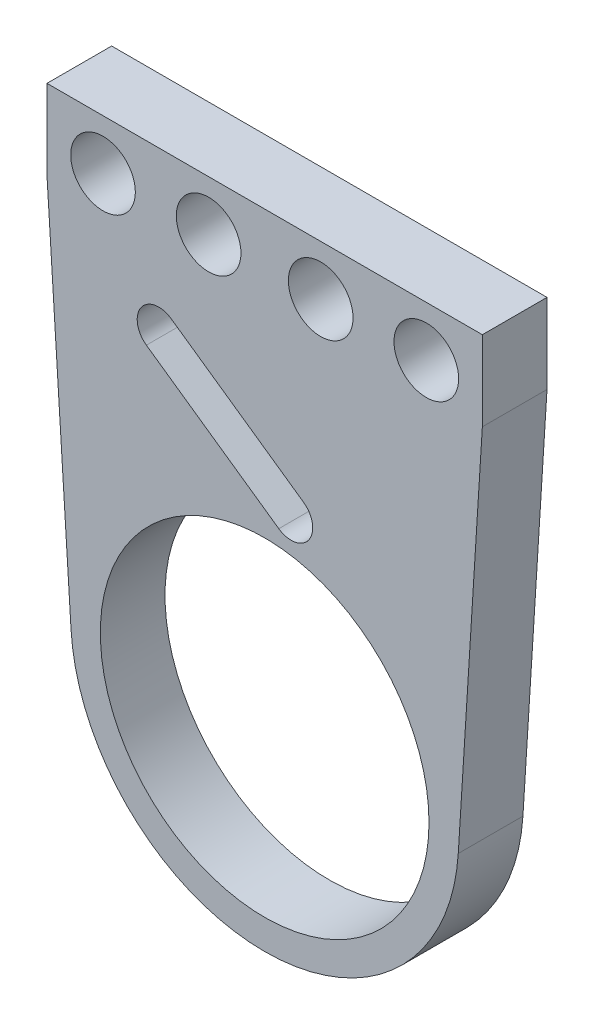
ISO-10303-21;
HEADER;
FILE_DESCRIPTION(('STEP AP214'),'2;1');
FILE_NAME('part.step','',(''),(''),'','','');
FILE_SCHEMA(('AUTOMOTIVE_DESIGN { 1 0 10303 214 1 1 1 1 }'));
ENDSEC;
DATA;
#1=APPLICATION_CONTEXT('core data for automotive mechanical design processes');
#2=APPLICATION_PROTOCOL_DEFINITION('international standard','automotive_design',2000,#1);
#3=PRODUCT_CONTEXT('',#1,'mechanical');
#4=PRODUCT('Part','Part','',(#3));
#5=PRODUCT_RELATED_PRODUCT_CATEGORY('part','',(#4));
#6=PRODUCT_DEFINITION_FORMATION('','',#4);
#7=PRODUCT_DEFINITION_CONTEXT('part definition',#1,'design');
#8=PRODUCT_DEFINITION('design','',#6,#7);
#9=PRODUCT_DEFINITION_SHAPE('','',#8);
#10=(LENGTH_UNIT() NAMED_UNIT(*) SI_UNIT(.MILLI.,.METRE.));
#11=(NAMED_UNIT(*) PLANE_ANGLE_UNIT() SI_UNIT($,.RADIAN.));
#12=(NAMED_UNIT(*) SI_UNIT($,.STERADIAN.) SOLID_ANGLE_UNIT());
#13=UNCERTAINTY_MEASURE_WITH_UNIT(LENGTH_MEASURE(1.E-05),#10,'distance_accuracy_value','');
#14=(GEOMETRIC_REPRESENTATION_CONTEXT(3) GLOBAL_UNCERTAINTY_ASSIGNED_CONTEXT((#13)) GLOBAL_UNIT_ASSIGNED_CONTEXT((#10,
#11,#12)) REPRESENTATION_CONTEXT('',''));
#15=CARTESIAN_POINT('',(0.,0.,0.));
#16=DIRECTION('',(0.,0.,1.));
#17=DIRECTION('',(1.,0.,0.));
#18=AXIS2_PLACEMENT_3D('',#15,#16,#17);
#19=CARTESIAN_POINT('',(0.,0.,6.));
#20=DIRECTION('',(0.,0.,1.));
#21=DIRECTION('',(1.,0.,0.));
#22=AXIS2_PLACEMENT_3D('',#19,#20,#21);
#23=PLANE('',#22);
#24=CARTESIAN_POINT('',(0.,0.,6.));
#25=DIRECTION('',(0.,0.,1.));
#26=DIRECTION('',(1.,0.,0.));
#27=AXIS2_PLACEMENT_3D('',#24,#25,#26);
#28=CIRCLE('',#27,15.25);
#29=CARTESIAN_POINT('',(15.25,0.,6.));
#30=VERTEX_POINT('',#29);
#31=EDGE_CURVE('E134',#30,#30,#28,.T.);
#32=ORIENTED_EDGE('',*,*,#31,.F.);
#33=EDGE_LOOP('',(#32));
#34=FACE_BOUND('',#33,.T.);
#35=CARTESIAN_POINT('',(-9.82982453146787,26.8829172362126,6.));
#36=DIRECTION('',(0.,0.,1.));
#37=DIRECTION('',(1.,0.,0.));
#38=AXIS2_PLACEMENT_3D('',#35,#36,#37);
#39=CIRCLE('',#38,2.);
#40=CARTESIAN_POINT('',(-8.68267165876577,28.5212213247906,6.));
#41=VERTEX_POINT('',#40);
#42=CARTESIAN_POINT('',(-10.97697740417,25.2446131476346,6.));
#43=VERTEX_POINT('',#42);
#44=EDGE_CURVE('E48',#41,#43,#39,.T.);
#45=ORIENTED_EDGE('',*,*,#44,.F.);
#46=DIRECTION('',(-0.819152044288989,0.57357643635105,0.));
#47=VECTOR('',#46,1.);
#48=CARTESIAN_POINT('',(-8.68267165876577,28.5212213247906,6.));
#49=LINE('',#48,#47);
#50=CARTESIAN_POINT('',(3.60460900556907,19.9175747795248,6.));
#51=VERTEX_POINT('',#50);
#52=EDGE_CURVE('E128',#51,#41,#49,.T.);
#53=ORIENTED_EDGE('',*,*,#52,.F.);
#54=CARTESIAN_POINT('',(2.45745613286697,18.2792706909468,6.));
#55=DIRECTION('',(0.,0.,1.));
#56=DIRECTION('',(1.,0.,0.));
#57=AXIS2_PLACEMENT_3D('',#54,#55,#56);
#58=CIRCLE('',#57,2.);
#59=CARTESIAN_POINT('',(1.31030326016487,16.6409666023689,6.));
#60=VERTEX_POINT('',#59);
#61=EDGE_CURVE('E131',#60,#51,#58,.T.);
#62=ORIENTED_EDGE('',*,*,#61,.F.);
#63=DIRECTION('',(0.819152044288989,-0.57357643635105,0.));
#64=VECTOR('',#63,1.);
#65=CARTESIAN_POINT('',(-10.97697740417,25.2446131476346,6.));
#66=LINE('',#65,#64);
#67=EDGE_CURVE('E140',#43,#60,#66,.T.);
#68=ORIENTED_EDGE('',*,*,#67,.F.);
#69=EDGE_LOOP('',(#45,#53,#62,#68));
#70=FACE_BOUND('',#69,.T.);
#71=CARTESIAN_POINT('',(5.19999999999999,37.0240523814777,6.));
#72=DIRECTION('',(0.,0.,1.));
#73=DIRECTION('',(1.,0.,0.));
#74=AXIS2_PLACEMENT_3D('',#71,#72,#73);
#75=CIRCLE('',#74,3.);
#76=CARTESIAN_POINT('',(8.19999999999999,37.0240523814777,6.));
#77=VERTEX_POINT('',#76);
#78=EDGE_CURVE('E157',#77,#77,#75,.T.);
#79=ORIENTED_EDGE('',*,*,#78,.F.);
#80=EDGE_LOOP('',(#79));
#81=FACE_BOUND('',#80,.T.);
#82=CARTESIAN_POINT('',(-15.,37.0240523814777,6.));
#83=DIRECTION('',(0.,0.,1.));
#84=DIRECTION('',(1.,0.,0.));
#85=AXIS2_PLACEMENT_3D('',#82,#83,#84);
#86=CIRCLE('',#85,3.);
#87=CARTESIAN_POINT('',(-12.,37.0240523814777,6.));
#88=VERTEX_POINT('',#87);
#89=EDGE_CURVE('E169',#88,#88,#86,.T.);
#90=ORIENTED_EDGE('',*,*,#89,.F.);
#91=EDGE_LOOP('',(#90));
#92=FACE_BOUND('',#91,.T.);
#93=DIRECTION('',(-1.,0.,0.));
#94=VECTOR('',#93,1.);
#95=CARTESIAN_POINT('',(-20.2,41.6740523814777,6.));
#96=LINE('',#95,#94);
#97=CARTESIAN_POINT('',(20.2,41.6740523814777,6.));
#98=VERTEX_POINT('',#97);
#99=CARTESIAN_POINT('',(-20.2,41.6740523814777,6.));
#100=VERTEX_POINT('',#99);
#101=EDGE_CURVE('E175',#98,#100,#96,.T.);
#102=ORIENTED_EDGE('',*,*,#101,.T.);
#103=DIRECTION('',(0.,-1.,0.));
#104=VECTOR('',#103,1.);
#105=CARTESIAN_POINT('',(-20.2,41.6740523814777,6.));
#106=LINE('',#105,#104);
#107=CARTESIAN_POINT('',(-20.2,34.2740523814777,6.));
#108=VERTEX_POINT('',#107);
#109=EDGE_CURVE('E178',#100,#108,#106,.T.);
#110=ORIENTED_EDGE('',*,*,#109,.T.);
#111=DIRECTION('',(0.0630171014224318,-0.998012447281253,0.));
#112=VECTOR('',#111,1.);
#113=CARTESIAN_POINT('',(-20.2,34.2740523814777,6.));
#114=LINE('',#113,#112);
#115=CARTESIAN_POINT('',(-17.9642240510625,-1.13430782560377,6.));
#116=VERTEX_POINT('',#115);
#117=EDGE_CURVE('E181',#108,#116,#114,.T.);
#118=ORIENTED_EDGE('',*,*,#117,.T.);
#119=CARTESIAN_POINT('',(0.,0.,6.));
#120=DIRECTION('',(0.,0.,1.));
#121=DIRECTION('',(1.,0.,0.));
#122=AXIS2_PLACEMENT_3D('',#119,#120,#121);
#123=CIRCLE('',#122,18.);
#124=CARTESIAN_POINT('',(17.9642240510626,-1.13430782560376,6.));
#125=VERTEX_POINT('',#124);
#126=EDGE_CURVE('E183',#116,#125,#123,.T.);
#127=ORIENTED_EDGE('',*,*,#126,.T.);
#128=DIRECTION('',(0.0630171014224309,0.998012447281253,0.));
#129=VECTOR('',#128,1.);
#130=CARTESIAN_POINT('',(20.2,34.2740523814777,6.));
#131=LINE('',#130,#129);
#132=CARTESIAN_POINT('',(20.2,34.2740523814777,6.));
#133=VERTEX_POINT('',#132);
#134=EDGE_CURVE('E185',#125,#133,#131,.T.);
#135=ORIENTED_EDGE('',*,*,#134,.T.);
#136=DIRECTION('',(0.,1.,0.));
#137=VECTOR('',#136,1.);
#138=CARTESIAN_POINT('',(20.2,41.6740523814777,6.));
#139=LINE('',#138,#137);
#140=EDGE_CURVE('E187',#133,#98,#139,.T.);
#141=ORIENTED_EDGE('',*,*,#140,.T.);
#142=EDGE_LOOP('',(#102,#110,#118,#127,#135,#141));
#143=FACE_BOUND('',#142,.T.);
#144=CARTESIAN_POINT('',(-5.20000000000001,37.0240523814777,6.));
#145=DIRECTION('',(0.,0.,1.));
#146=DIRECTION('',(1.,0.,0.));
#147=AXIS2_PLACEMENT_3D('',#144,#145,#146);
#148=CIRCLE('',#147,3.);
#149=CARTESIAN_POINT('',(-2.20000000000001,37.0240523814777,6.));
#150=VERTEX_POINT('',#149);
#151=EDGE_CURVE('E163',#150,#150,#148,.T.);
#152=ORIENTED_EDGE('',*,*,#151,.F.);
#153=EDGE_LOOP('',(#152));
#154=FACE_BOUND('',#153,.T.);
#155=CARTESIAN_POINT('',(15.,37.0240523814777,6.));
#156=DIRECTION('',(0.,0.,1.));
#157=DIRECTION('',(1.,0.,0.));
#158=AXIS2_PLACEMENT_3D('',#155,#156,#157);
#159=CIRCLE('',#158,3.);
#160=CARTESIAN_POINT('',(18.,37.0240523814777,6.));
#161=VERTEX_POINT('',#160);
#162=EDGE_CURVE('E151',#161,#161,#159,.T.);
#163=ORIENTED_EDGE('',*,*,#162,.F.);
#164=EDGE_LOOP('',(#163));
#165=FACE_BOUND('',#164,.T.);
#166=ADVANCED_FACE('F33',(#34,#70,#81,#92,#143,#154,#165),#23,.T.);
#167=CARTESIAN_POINT('',(0.,0.,0.));
#168=DIRECTION('',(0.,0.,1.));
#169=DIRECTION('',(1.,0.,0.));
#170=AXIS2_PLACEMENT_3D('',#167,#168,#169);
#171=PLANE('',#170);
#172=CARTESIAN_POINT('',(0.,0.,0.));
#173=DIRECTION('',(0.,0.,1.));
#174=DIRECTION('',(1.,0.,0.));
#175=AXIS2_PLACEMENT_3D('',#172,#173,#174);
#176=CIRCLE('',#175,15.25);
#177=CARTESIAN_POINT('',(15.25,0.,0.));
#178=VERTEX_POINT('',#177);
#179=EDGE_CURVE('E141',#178,#178,#176,.T.);
#180=ORIENTED_EDGE('',*,*,#179,.T.);
#181=EDGE_LOOP('',(#180));
#182=FACE_BOUND('',#181,.T.);
#183=DIRECTION('',(-0.819152044288989,0.57357643635105,0.));
#184=VECTOR('',#183,1.);
#185=CARTESIAN_POINT('',(-8.68267165876577,28.5212213247906,0.));
#186=LINE('',#185,#184);
#187=CARTESIAN_POINT('',(3.60460900556907,19.9175747795248,0.));
#188=VERTEX_POINT('',#187);
#189=CARTESIAN_POINT('',(-8.68267165876577,28.5212213247906,0.));
#190=VERTEX_POINT('',#189);
#191=EDGE_CURVE('E118',#188,#190,#186,.T.);
#192=ORIENTED_EDGE('',*,*,#191,.T.);
#193=CARTESIAN_POINT('',(-9.82982453146787,26.8829172362126,0.));
#194=DIRECTION('',(0.,0.,1.));
#195=DIRECTION('',(1.,0.,0.));
#196=AXIS2_PLACEMENT_3D('',#193,#194,#195);
#197=CIRCLE('',#196,2.);
#198=CARTESIAN_POINT('',(-10.97697740417,25.2446131476346,0.));
#199=VERTEX_POINT('',#198);
#200=EDGE_CURVE('E112',#190,#199,#197,.T.);
#201=ORIENTED_EDGE('',*,*,#200,.T.);
#202=DIRECTION('',(0.819152044288989,-0.57357643635105,0.));
#203=VECTOR('',#202,1.);
#204=CARTESIAN_POINT('',(-10.97697740417,25.2446131476346,0.));
#205=LINE('',#204,#203);
#206=CARTESIAN_POINT('',(1.31030326016486,16.6409666023689,0.));
#207=VERTEX_POINT('',#206);
#208=EDGE_CURVE('E121',#199,#207,#205,.T.);
#209=ORIENTED_EDGE('',*,*,#208,.T.);
#210=CARTESIAN_POINT('',(2.45745613286697,18.2792706909468,0.));
#211=DIRECTION('',(0.,0.,1.));
#212=DIRECTION('',(1.,0.,0.));
#213=AXIS2_PLACEMENT_3D('',#210,#211,#212);
#214=CIRCLE('',#213,2.);
#215=EDGE_CURVE('E56',#207,#188,#214,.T.);
#216=ORIENTED_EDGE('',*,*,#215,.T.);
#217=EDGE_LOOP('',(#192,#201,#209,#216));
#218=FACE_BOUND('',#217,.T.);
#219=CARTESIAN_POINT('',(5.19999999999999,37.0240523814777,0.));
#220=DIRECTION('',(0.,0.,1.));
#221=DIRECTION('',(1.,0.,0.));
#222=AXIS2_PLACEMENT_3D('',#219,#220,#221);
#223=CIRCLE('',#222,3.);
#224=CARTESIAN_POINT('',(8.19999999999999,37.0240523814777,0.));
#225=VERTEX_POINT('',#224);
#226=EDGE_CURVE('E154',#225,#225,#223,.T.);
#227=ORIENTED_EDGE('',*,*,#226,.T.);
#228=EDGE_LOOP('',(#227));
#229=FACE_BOUND('',#228,.T.);
#230=CARTESIAN_POINT('',(-15.,37.0240523814777,0.));
#231=DIRECTION('',(0.,0.,1.));
#232=DIRECTION('',(1.,0.,0.));
#233=AXIS2_PLACEMENT_3D('',#230,#231,#232);
#234=CIRCLE('',#233,3.);
#235=CARTESIAN_POINT('',(-12.,37.0240523814777,0.));
#236=VERTEX_POINT('',#235);
#237=EDGE_CURVE('E166',#236,#236,#234,.T.);
#238=ORIENTED_EDGE('',*,*,#237,.T.);
#239=EDGE_LOOP('',(#238));
#240=FACE_BOUND('',#239,.T.);
#241=DIRECTION('',(0.,-1.,0.));
#242=VECTOR('',#241,1.);
#243=CARTESIAN_POINT('',(-20.2,41.6740523814777,0.));
#244=LINE('',#243,#242);
#245=CARTESIAN_POINT('',(-20.2,41.6740523814777,0.));
#246=VERTEX_POINT('',#245);
#247=CARTESIAN_POINT('',(-20.2,34.2740523814777,0.));
#248=VERTEX_POINT('',#247);
#249=EDGE_CURVE('E172',#246,#248,#244,.T.);
#250=ORIENTED_EDGE('',*,*,#249,.F.);
#251=DIRECTION('',(-1.,0.,0.));
#252=VECTOR('',#251,1.);
#253=CARTESIAN_POINT('',(0.,41.6740523814777,0.));
#254=LINE('',#253,#252);
#255=CARTESIAN_POINT('',(20.2,41.6740523814777,0.));
#256=VERTEX_POINT('',#255);
#257=EDGE_CURVE('E179',#256,#246,#254,.T.);
#258=ORIENTED_EDGE('',*,*,#257,.F.);
#259=DIRECTION('',(0.,1.,0.));
#260=VECTOR('',#259,1.);
#261=CARTESIAN_POINT('',(20.2,41.6740523814777,0.));
#262=LINE('',#261,#260);
#263=CARTESIAN_POINT('',(20.2,34.2740523814777,0.));
#264=VERTEX_POINT('',#263);
#265=EDGE_CURVE('E198',#264,#256,#262,.T.);
#266=ORIENTED_EDGE('',*,*,#265,.F.);
#267=DIRECTION('',(0.0630171014224309,0.998012447281253,0.));
#268=VECTOR('',#267,1.);
#269=CARTESIAN_POINT('',(20.2,34.2740523814777,0.));
#270=LINE('',#269,#268);
#271=CARTESIAN_POINT('',(17.9642240510626,-1.13430782560376,0.));
#272=VERTEX_POINT('',#271);
#273=EDGE_CURVE('E196',#272,#264,#270,.T.);
#274=ORIENTED_EDGE('',*,*,#273,.F.);
#275=CARTESIAN_POINT('',(0.,0.,0.));
#276=DIRECTION('',(0.,0.,1.));
#277=DIRECTION('',(1.,0.,0.));
#278=AXIS2_PLACEMENT_3D('',#275,#276,#277);
#279=CIRCLE('',#278,18.);
#280=CARTESIAN_POINT('',(-17.9642240510625,-1.13430782560377,0.));
#281=VERTEX_POINT('',#280);
#282=EDGE_CURVE('E194',#281,#272,#279,.T.);
#283=ORIENTED_EDGE('',*,*,#282,.F.);
#284=DIRECTION('',(0.0630171014224318,-0.998012447281253,0.));
#285=VECTOR('',#284,1.);
#286=CARTESIAN_POINT('',(-20.2,34.2740523814777,0.));
#287=LINE('',#286,#285);
#288=EDGE_CURVE('E192',#248,#281,#287,.T.);
#289=ORIENTED_EDGE('',*,*,#288,.F.);
#290=EDGE_LOOP('',(#250,#258,#266,#274,#283,#289));
#291=FACE_BOUND('',#290,.T.);
#292=CARTESIAN_POINT('',(-5.20000000000001,37.0240523814777,0.));
#293=DIRECTION('',(0.,0.,1.));
#294=DIRECTION('',(1.,0.,0.));
#295=AXIS2_PLACEMENT_3D('',#292,#293,#294);
#296=CIRCLE('',#295,3.);
#297=CARTESIAN_POINT('',(-2.20000000000001,37.0240523814777,0.));
#298=VERTEX_POINT('',#297);
#299=EDGE_CURVE('E160',#298,#298,#296,.T.);
#300=ORIENTED_EDGE('',*,*,#299,.T.);
#301=EDGE_LOOP('',(#300));
#302=FACE_BOUND('',#301,.T.);
#303=CARTESIAN_POINT('',(15.,37.0240523814777,0.));
#304=DIRECTION('',(0.,0.,1.));
#305=DIRECTION('',(1.,0.,0.));
#306=AXIS2_PLACEMENT_3D('',#303,#304,#305);
#307=CIRCLE('',#306,3.);
#308=CARTESIAN_POINT('',(18.,37.0240523814777,0.));
#309=VERTEX_POINT('',#308);
#310=EDGE_CURVE('E147',#309,#309,#307,.T.);
#311=ORIENTED_EDGE('',*,*,#310,.T.);
#312=EDGE_LOOP('',(#311));
#313=FACE_BOUND('',#312,.T.);
#314=ADVANCED_FACE('F125',(#182,#218,#229,#240,#291,#302,#313),#171,.F.);
#315=CARTESIAN_POINT('',(-20.2,41.6740523814777,6.));
#316=DIRECTION('',(1.,0.,0.));
#317=DIRECTION('',(0.,0.,-1.));
#318=AXIS2_PLACEMENT_3D('',#315,#316,#317);
#319=PLANE('',#318);
#320=ORIENTED_EDGE('',*,*,#249,.T.);
#321=DIRECTION('',(0.,0.,-1.));
#322=VECTOR('',#321,1.);
#323=CARTESIAN_POINT('',(-20.2,34.2740523814777,6.));
#324=LINE('',#323,#322);
#325=EDGE_CURVE('E41',#108,#248,#324,.T.);
#326=ORIENTED_EDGE('',*,*,#325,.F.);
#327=ORIENTED_EDGE('',*,*,#109,.F.);
#328=DIRECTION('',(0.,0.,-1.));
#329=VECTOR('',#328,1.);
#330=CARTESIAN_POINT('',(-20.2,41.6740523814777,6.));
#331=LINE('',#330,#329);
#332=EDGE_CURVE('E11',#100,#246,#331,.T.);
#333=ORIENTED_EDGE('',*,*,#332,.T.);
#334=EDGE_LOOP('',(#320,#326,#327,#333));
#335=FACE_BOUND('',#334,.T.);
#336=ADVANCED_FACE('F35',(#335),#319,.F.);
#337=CARTESIAN_POINT('',(-20.2,34.2740523814777,6.));
#338=DIRECTION('',(0.998012447281252,0.0630171014224318,0.));
#339=DIRECTION('',(-0.0630171014224318,0.998012447281253,0.));
#340=AXIS2_PLACEMENT_3D('',#337,#338,#339);
#341=PLANE('',#340);
#342=ORIENTED_EDGE('',*,*,#288,.T.);
#343=DIRECTION('',(0.,0.,-1.));
#344=VECTOR('',#343,1.);
#345=CARTESIAN_POINT('',(-17.9642240510625,-1.13430782560377,6.));
#346=LINE('',#345,#344);
#347=EDGE_CURVE('E209',#116,#281,#346,.T.);
#348=ORIENTED_EDGE('',*,*,#347,.F.);
#349=ORIENTED_EDGE('',*,*,#117,.F.);
#350=ORIENTED_EDGE('',*,*,#325,.T.);
#351=EDGE_LOOP('',(#342,#348,#349,#350));
#352=FACE_BOUND('',#351,.T.);
#353=ADVANCED_FACE('F216',(#352),#341,.F.);
#354=CARTESIAN_POINT('',(0.,0.,6.));
#355=DIRECTION('',(0.,0.,-1.));
#356=DIRECTION('',(-1.,0.,0.));
#357=AXIS2_PLACEMENT_3D('',#354,#355,#356);
#358=CYLINDRICAL_SURFACE('',#357,18.);
#359=ORIENTED_EDGE('',*,*,#282,.T.);
#360=DIRECTION('',(0.,0.,-1.));
#361=VECTOR('',#360,1.);
#362=CARTESIAN_POINT('',(17.9642240510626,-1.13430782560376,6.));
#363=LINE('',#362,#361);
#364=EDGE_CURVE('E206',#125,#272,#363,.T.);
#365=ORIENTED_EDGE('',*,*,#364,.F.);
#366=ORIENTED_EDGE('',*,*,#126,.F.);
#367=ORIENTED_EDGE('',*,*,#347,.T.);
#368=EDGE_LOOP('',(#359,#365,#366,#367));
#369=FACE_BOUND('',#368,.T.);
#370=ADVANCED_FACE('F228',(#369),#358,.T.);
#371=CARTESIAN_POINT('',(20.2,34.2740523814777,6.));
#372=DIRECTION('',(-0.998012447281253,0.0630171014224309,0.));
#373=DIRECTION('',(-0.0630171014224309,-0.998012447281253,0.));
#374=AXIS2_PLACEMENT_3D('',#371,#372,#373);
#375=PLANE('',#374);
#376=ORIENTED_EDGE('',*,*,#273,.T.);
#377=DIRECTION('',(0.,0.,-1.));
#378=VECTOR('',#377,1.);
#379=CARTESIAN_POINT('',(20.2,34.2740523814777,6.));
#380=LINE('',#379,#378);
#381=EDGE_CURVE('E203',#133,#264,#380,.T.);
#382=ORIENTED_EDGE('',*,*,#381,.F.);
#383=ORIENTED_EDGE('',*,*,#134,.F.);
#384=ORIENTED_EDGE('',*,*,#364,.T.);
#385=EDGE_LOOP('',(#376,#382,#383,#384));
#386=FACE_BOUND('',#385,.T.);
#387=ADVANCED_FACE('F232',(#386),#375,.F.);
#388=CARTESIAN_POINT('',(20.2,41.6740523814777,6.));
#389=DIRECTION('',(-1.,0.,0.));
#390=DIRECTION('',(0.,-1.,0.));
#391=AXIS2_PLACEMENT_3D('',#388,#389,#390);
#392=PLANE('',#391);
#393=ORIENTED_EDGE('',*,*,#265,.T.);
#394=DIRECTION('',(0.,0.,-1.));
#395=VECTOR('',#394,1.);
#396=CARTESIAN_POINT('',(20.2,41.6740523814777,6.));
#397=LINE('',#396,#395);
#398=EDGE_CURVE('E190',#98,#256,#397,.T.);
#399=ORIENTED_EDGE('',*,*,#398,.F.);
#400=ORIENTED_EDGE('',*,*,#140,.F.);
#401=ORIENTED_EDGE('',*,*,#381,.T.);
#402=EDGE_LOOP('',(#393,#399,#400,#401));
#403=FACE_BOUND('',#402,.T.);
#404=ADVANCED_FACE('F242',(#403),#392,.F.);
#405=CARTESIAN_POINT('',(0.,41.6740523814777,6.));
#406=DIRECTION('',(0.,-1.,0.));
#407=DIRECTION('',(0.,0.,-1.));
#408=AXIS2_PLACEMENT_3D('',#405,#406,#407);
#409=PLANE('',#408);
#410=ORIENTED_EDGE('',*,*,#257,.T.);
#411=ORIENTED_EDGE('',*,*,#332,.F.);
#412=ORIENTED_EDGE('',*,*,#101,.F.);
#413=ORIENTED_EDGE('',*,*,#398,.T.);
#414=EDGE_LOOP('',(#410,#411,#412,#413));
#415=FACE_BOUND('',#414,.T.);
#416=ADVANCED_FACE('F240',(#415),#409,.F.);
#417=CARTESIAN_POINT('',(-15.,37.0240523814777,6.));
#418=DIRECTION('',(0.,0.,-1.));
#419=DIRECTION('',(-1.,0.,0.));
#420=AXIS2_PLACEMENT_3D('',#417,#418,#419);
#421=CYLINDRICAL_SURFACE('',#420,3.);
#422=ORIENTED_EDGE('',*,*,#89,.T.);
#423=EDGE_LOOP('',(#422));
#424=FACE_BOUND('',#423,.T.);
#425=ORIENTED_EDGE('',*,*,#237,.F.);
#426=EDGE_LOOP('',(#425));
#427=FACE_BOUND('',#426,.T.);
#428=ADVANCED_FACE('F249',(#424,#427),#421,.F.);
#429=CARTESIAN_POINT('',(-5.20000000000001,37.0240523814777,6.));
#430=DIRECTION('',(0.,0.,-1.));
#431=DIRECTION('',(-1.,0.,0.));
#432=AXIS2_PLACEMENT_3D('',#429,#430,#431);
#433=CYLINDRICAL_SURFACE('',#432,3.);
#434=ORIENTED_EDGE('',*,*,#151,.T.);
#435=EDGE_LOOP('',(#434));
#436=FACE_BOUND('',#435,.T.);
#437=ORIENTED_EDGE('',*,*,#299,.F.);
#438=EDGE_LOOP('',(#437));
#439=FACE_BOUND('',#438,.T.);
#440=ADVANCED_FACE('F265',(#436,#439),#433,.F.);
#441=CARTESIAN_POINT('',(5.19999999999999,37.0240523814777,6.));
#442=DIRECTION('',(0.,0.,-1.));
#443=DIRECTION('',(-1.,0.,0.));
#444=AXIS2_PLACEMENT_3D('',#441,#442,#443);
#445=CYLINDRICAL_SURFACE('',#444,3.);
#446=ORIENTED_EDGE('',*,*,#78,.T.);
#447=EDGE_LOOP('',(#446));
#448=FACE_BOUND('',#447,.T.);
#449=ORIENTED_EDGE('',*,*,#226,.F.);
#450=EDGE_LOOP('',(#449));
#451=FACE_BOUND('',#450,.T.);
#452=ADVANCED_FACE('F269',(#448,#451),#445,.F.);
#453=CARTESIAN_POINT('',(15.,37.0240523814777,6.));
#454=DIRECTION('',(0.,0.,-1.));
#455=DIRECTION('',(-1.,0.,0.));
#456=AXIS2_PLACEMENT_3D('',#453,#454,#455);
#457=CYLINDRICAL_SURFACE('',#456,3.);
#458=ORIENTED_EDGE('',*,*,#162,.T.);
#459=EDGE_LOOP('',(#458));
#460=FACE_BOUND('',#459,.T.);
#461=ORIENTED_EDGE('',*,*,#310,.F.);
#462=EDGE_LOOP('',(#461));
#463=FACE_BOUND('',#462,.T.);
#464=ADVANCED_FACE('F273',(#460,#463),#457,.F.);
#465=CARTESIAN_POINT('',(-9.82982453146787,26.8829172362126,0.));
#466=DIRECTION('',(0.,0.,1.));
#467=DIRECTION('',(1.,0.,0.));
#468=AXIS2_PLACEMENT_3D('',#465,#466,#467);
#469=CYLINDRICAL_SURFACE('',#468,2.);
#470=ORIENTED_EDGE('',*,*,#44,.T.);
#471=DIRECTION('',(0.,0.,1.));
#472=VECTOR('',#471,1.);
#473=CARTESIAN_POINT('',(-10.97697740417,25.2446131476346,0.));
#474=LINE('',#473,#472);
#475=EDGE_CURVE('E108',#199,#43,#474,.T.);
#476=ORIENTED_EDGE('',*,*,#475,.F.);
#477=ORIENTED_EDGE('',*,*,#200,.F.);
#478=DIRECTION('',(0.,0.,1.));
#479=VECTOR('',#478,1.);
#480=CARTESIAN_POINT('',(-8.68267165876577,28.5212213247906,0.));
#481=LINE('',#480,#479);
#482=EDGE_CURVE('E145',#190,#41,#481,.T.);
#483=ORIENTED_EDGE('',*,*,#482,.T.);
#484=EDGE_LOOP('',(#470,#476,#477,#483));
#485=FACE_BOUND('',#484,.T.);
#486=ADVANCED_FACE('F110',(#485),#469,.F.);
#487=CARTESIAN_POINT('',(-8.68267165876577,28.5212213247906,0.));
#488=DIRECTION('',(0.57357643635105,0.819152044288989,0.));
#489=DIRECTION('',(-0.819152044288989,0.57357643635105,0.));
#490=AXIS2_PLACEMENT_3D('',#487,#488,#489);
#491=PLANE('',#490);
#492=ORIENTED_EDGE('',*,*,#52,.T.);
#493=ORIENTED_EDGE('',*,*,#482,.F.);
#494=ORIENTED_EDGE('',*,*,#191,.F.);
#495=DIRECTION('',(0.,0.,1.));
#496=VECTOR('',#495,1.);
#497=CARTESIAN_POINT('',(3.60460900556907,19.9175747795248,0.));
#498=LINE('',#497,#496);
#499=EDGE_CURVE('E148',#188,#51,#498,.T.);
#500=ORIENTED_EDGE('',*,*,#499,.T.);
#501=EDGE_LOOP('',(#492,#493,#494,#500));
#502=FACE_BOUND('',#501,.T.);
#503=ADVANCED_FACE('F280',(#502),#491,.F.);
#504=CARTESIAN_POINT('',(2.45745613286697,18.2792706909468,0.));
#505=DIRECTION('',(0.,0.,1.));
#506=DIRECTION('',(1.,0.,0.));
#507=AXIS2_PLACEMENT_3D('',#504,#505,#506);
#508=CYLINDRICAL_SURFACE('',#507,2.);
#509=ORIENTED_EDGE('',*,*,#61,.T.);
#510=ORIENTED_EDGE('',*,*,#499,.F.);
#511=ORIENTED_EDGE('',*,*,#215,.F.);
#512=DIRECTION('',(0.,0.,1.));
#513=VECTOR('',#512,1.);
#514=CARTESIAN_POINT('',(1.31030326016487,16.6409666023689,0.));
#515=LINE('',#514,#513);
#516=EDGE_CURVE('E117',#207,#60,#515,.T.);
#517=ORIENTED_EDGE('',*,*,#516,.T.);
#518=EDGE_LOOP('',(#509,#510,#511,#517));
#519=FACE_BOUND('',#518,.T.);
#520=ADVANCED_FACE('F284',(#519),#508,.F.);
#521=CARTESIAN_POINT('',(-10.97697740417,25.2446131476346,0.));
#522=DIRECTION('',(-0.57357643635105,-0.819152044288989,0.));
#523=DIRECTION('',(0.819152044288989,-0.57357643635105,0.));
#524=AXIS2_PLACEMENT_3D('',#521,#522,#523);
#525=PLANE('',#524);
#526=ORIENTED_EDGE('',*,*,#67,.T.);
#527=ORIENTED_EDGE('',*,*,#516,.F.);
#528=ORIENTED_EDGE('',*,*,#208,.F.);
#529=ORIENTED_EDGE('',*,*,#475,.T.);
#530=EDGE_LOOP('',(#526,#527,#528,#529));
#531=FACE_BOUND('',#530,.T.);
#532=ADVANCED_FACE('F122',(#531),#525,.F.);
#533=CARTESIAN_POINT('',(0.,0.,0.));
#534=DIRECTION('',(0.,0.,1.));
#535=DIRECTION('',(1.,0.,0.));
#536=AXIS2_PLACEMENT_3D('',#533,#534,#535);
#537=CYLINDRICAL_SURFACE('',#536,15.25);
#538=ORIENTED_EDGE('',*,*,#179,.F.);
#539=EDGE_LOOP('',(#538));
#540=FACE_BOUND('',#539,.T.);
#541=ORIENTED_EDGE('',*,*,#31,.T.);
#542=EDGE_LOOP('',(#541));
#543=FACE_BOUND('',#542,.T.);
#544=ADVANCED_FACE('F283',(#540,#543),#537,.F.);
#545=CLOSED_SHELL('',(#166,#314,#336,#353,#370,#387,#404,#416,#428,#440,#452,#464,#486,#503,
#520,#532,#544));
#546=MANIFOLD_SOLID_BREP('B2',#545);
#547=ADVANCED_BREP_SHAPE_REPRESENTATION('',(#18,#546),#14);
#548=SHAPE_DEFINITION_REPRESENTATION(#9,#547);
ENDSEC;
END-ISO-10303-21;
